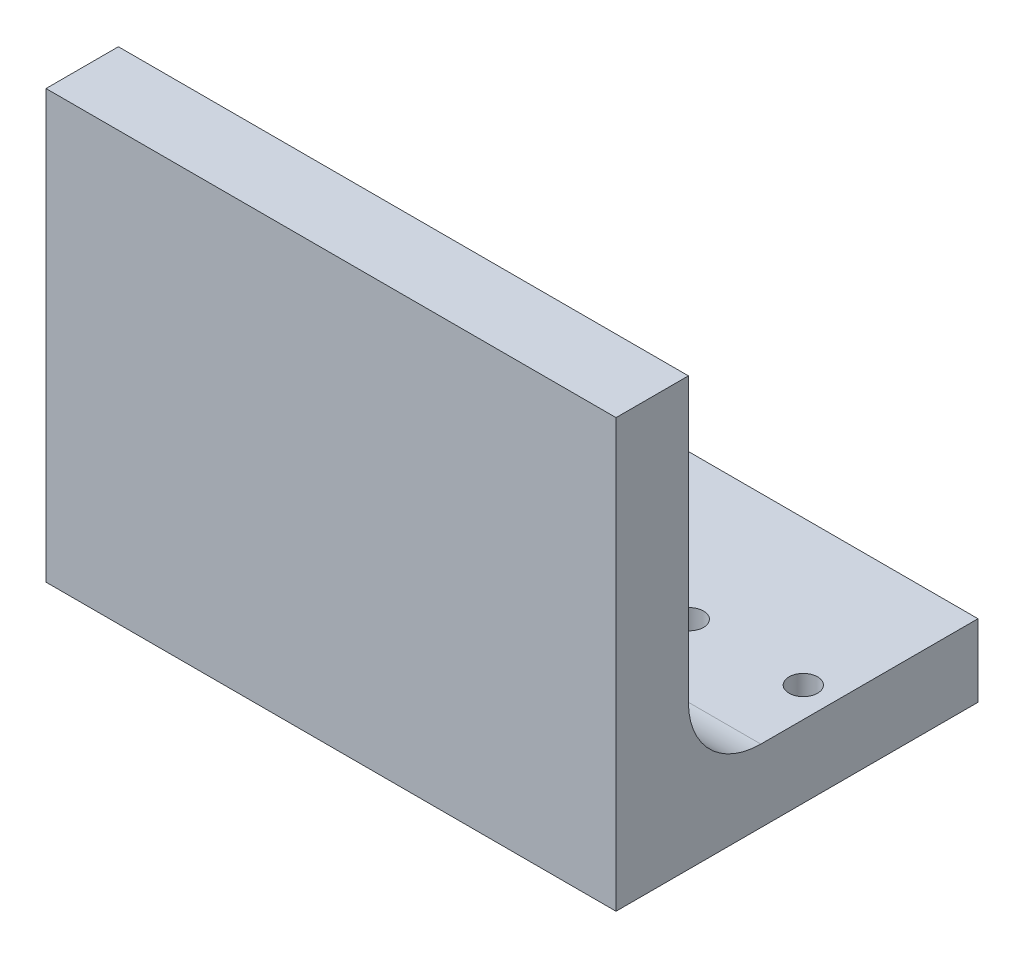
ISO-10303-21;
HEADER;
FILE_DESCRIPTION(('STEP AP214'),'2;1');
FILE_NAME('part.step','',(''),(''),'','','');
FILE_SCHEMA(('AUTOMOTIVE_DESIGN { 1 0 10303 214 1 1 1 1 }'));
ENDSEC;
DATA;
#1=APPLICATION_CONTEXT('core data for automotive mechanical design processes');
#2=APPLICATION_PROTOCOL_DEFINITION('international standard','automotive_design',2000,#1);
#3=PRODUCT_CONTEXT('',#1,'mechanical');
#4=PRODUCT('Part','Part','',(#3));
#5=PRODUCT_RELATED_PRODUCT_CATEGORY('part','',(#4));
#6=PRODUCT_DEFINITION_FORMATION('','',#4);
#7=PRODUCT_DEFINITION_CONTEXT('part definition',#1,'design');
#8=PRODUCT_DEFINITION('design','',#6,#7);
#9=PRODUCT_DEFINITION_SHAPE('','',#8);
#10=(LENGTH_UNIT() NAMED_UNIT(*) SI_UNIT(.MILLI.,.METRE.));
#11=(NAMED_UNIT(*) PLANE_ANGLE_UNIT() SI_UNIT($,.RADIAN.));
#12=(NAMED_UNIT(*) SI_UNIT($,.STERADIAN.) SOLID_ANGLE_UNIT());
#13=UNCERTAINTY_MEASURE_WITH_UNIT(LENGTH_MEASURE(1.E-05),#10,'distance_accuracy_value','');
#14=(GEOMETRIC_REPRESENTATION_CONTEXT(3) GLOBAL_UNCERTAINTY_ASSIGNED_CONTEXT((#13)) GLOBAL_UNIT_ASSIGNED_CONTEXT((#10,
#11,#12)) REPRESENTATION_CONTEXT('',''));
#15=CARTESIAN_POINT('',(0.,0.,0.));
#16=DIRECTION('',(0.,0.,1.));
#17=DIRECTION('',(1.,0.,0.));
#18=AXIS2_PLACEMENT_3D('',#15,#16,#17);
#19=CARTESIAN_POINT('',(0.,0.,0.));
#20=DIRECTION('',(0.,0.,1.));
#21=DIRECTION('',(1.,0.,0.));
#22=AXIS2_PLACEMENT_3D('',#19,#20,#21);
#23=PLANE('',#22);
#24=DIRECTION('',(0.,1.,0.));
#25=VECTOR('',#24,1.);
#26=CARTESIAN_POINT('',(10.,15.,0.));
#27=LINE('',#26,#25);
#28=CARTESIAN_POINT('',(10.,5.08,0.));
#29=VERTEX_POINT('',#28);
#30=CARTESIAN_POINT('',(10.,15.,0.));
#31=VERTEX_POINT('',#30);
#32=EDGE_CURVE('E146',#29,#31,#27,.T.);
#33=ORIENTED_EDGE('',*,*,#32,.F.);
#34=DIRECTION('',(1.,0.,0.));
#35=VECTOR('',#34,1.);
#36=CARTESIAN_POINT('',(-10.,5.08,0.));
#37=LINE('',#36,#35);
#38=CARTESIAN_POINT('',(-10.,5.08,0.));
#39=VERTEX_POINT('',#38);
#40=EDGE_CURVE('E60',#29,#39,#37,.F.);
#41=ORIENTED_EDGE('',*,*,#40,.T.);
#42=DIRECTION('',(0.,-1.,0.));
#43=VECTOR('',#42,1.);
#44=CARTESIAN_POINT('',(-10.,15.,0.));
#45=LINE('',#44,#43);
#46=CARTESIAN_POINT('',(-10.,15.,0.));
#47=VERTEX_POINT('',#46);
#48=EDGE_CURVE('E134',#47,#39,#45,.T.);
#49=ORIENTED_EDGE('',*,*,#48,.F.);
#50=DIRECTION('',(-1.,0.,0.));
#51=VECTOR('',#50,1.);
#52=CARTESIAN_POINT('',(-10.,15.,0.));
#53=LINE('',#52,#51);
#54=EDGE_CURVE('E139',#31,#47,#53,.T.);
#55=ORIENTED_EDGE('',*,*,#54,.F.);
#56=EDGE_LOOP('',(#33,#41,#49,#55));
#57=FACE_BOUND('',#56,.T.);
#58=ADVANCED_FACE('F39',(#57),#23,.F.);
#59=CARTESIAN_POINT('',(-10.,15.,2.54));
#60=DIRECTION('',(1.,0.,0.));
#61=DIRECTION('',(0.,1.,0.));
#62=AXIS2_PLACEMENT_3D('',#59,#60,#61);
#63=PLANE('',#62);
#64=ORIENTED_EDGE('',*,*,#48,.T.);
#65=CARTESIAN_POINT('',(-10.,5.08,-2.54));
#66=DIRECTION('',(1.,0.,0.));
#67=DIRECTION('',(0.,1.,0.));
#68=AXIS2_PLACEMENT_3D('',#65,#66,#67);
#69=CIRCLE('',#68,2.54);
#70=CARTESIAN_POINT('',(-10.,2.54,-2.54));
#71=VERTEX_POINT('',#70);
#72=EDGE_CURVE('E11',#39,#71,#69,.T.);
#73=ORIENTED_EDGE('',*,*,#72,.T.);
#74=DIRECTION('',(0.,0.,1.));
#75=VECTOR('',#74,1.);
#76=CARTESIAN_POINT('',(-10.,2.54,-10.16));
#77=LINE('',#76,#75);
#78=CARTESIAN_POINT('',(-10.,2.54,-10.16));
#79=VERTEX_POINT('',#78);
#80=EDGE_CURVE('E131',#79,#71,#77,.T.);
#81=ORIENTED_EDGE('',*,*,#80,.F.);
#82=DIRECTION('',(0.,1.,0.));
#83=VECTOR('',#82,1.);
#84=CARTESIAN_POINT('',(-10.,0.,-10.16));
#85=LINE('',#84,#83);
#86=CARTESIAN_POINT('',(-10.,0.,-10.16));
#87=VERTEX_POINT('',#86);
#88=EDGE_CURVE('E114',#87,#79,#85,.T.);
#89=ORIENTED_EDGE('',*,*,#88,.F.);
#90=DIRECTION('',(0.,0.,-1.));
#91=VECTOR('',#90,1.);
#92=CARTESIAN_POINT('',(-10.,0.,2.54));
#93=LINE('',#92,#91);
#94=CARTESIAN_POINT('',(-10.,0.,2.54));
#95=VERTEX_POINT('',#94);
#96=EDGE_CURVE('E105',#95,#87,#93,.T.);
#97=ORIENTED_EDGE('',*,*,#96,.F.);
#98=DIRECTION('',(0.,-1.,0.));
#99=VECTOR('',#98,1.);
#100=CARTESIAN_POINT('',(-10.,15.,2.54));
#101=LINE('',#100,#99);
#102=CARTESIAN_POINT('',(-10.,15.,2.54));
#103=VERTEX_POINT('',#102);
#104=EDGE_CURVE('E135',#103,#95,#101,.T.);
#105=ORIENTED_EDGE('',*,*,#104,.F.);
#106=DIRECTION('',(0.,0.,-1.));
#107=VECTOR('',#106,1.);
#108=CARTESIAN_POINT('',(-10.,15.,2.54));
#109=LINE('',#108,#107);
#110=EDGE_CURVE('E144',#103,#47,#109,.T.);
#111=ORIENTED_EDGE('',*,*,#110,.T.);
#112=EDGE_LOOP('',(#64,#73,#81,#89,#97,#105,#111));
#113=FACE_BOUND('',#112,.T.);
#114=ADVANCED_FACE('F164',(#113),#63,.F.);
#115=CARTESIAN_POINT('',(-10.,0.,2.54));
#116=DIRECTION('',(0.,1.,0.));
#117=DIRECTION('',(0.,0.,1.));
#118=AXIS2_PLACEMENT_3D('',#115,#116,#117);
#119=PLANE('',#118);
#120=CARTESIAN_POINT('',(-8.35000000000003,0.,-5.08000000000005));
#121=DIRECTION('',(0.,1.,0.));
#122=DIRECTION('',(0.,0.,1.));
#123=AXIS2_PLACEMENT_3D('',#120,#121,#122);
#124=CIRCLE('',#123,0.500000000000019);
#125=CARTESIAN_POINT('',(-8.35000000000003,0.,-4.58000000000003));
#126=VERTEX_POINT('',#125);
#127=EDGE_CURVE('E199',#126,#126,#124,.T.);
#128=ORIENTED_EDGE('',*,*,#127,.T.);
#129=EDGE_LOOP('',(#128));
#130=FACE_BOUND('',#129,.T.);
#131=CARTESIAN_POINT('',(-4.35000000000003,0.,-5.08000000000008));
#132=DIRECTION('',(0.,1.,0.));
#133=DIRECTION('',(0.,0.,1.));
#134=AXIS2_PLACEMENT_3D('',#131,#132,#133);
#135=CIRCLE('',#134,0.500000000000018);
#136=CARTESIAN_POINT('',(-4.35000000000003,0.,-4.58000000000006));
#137=VERTEX_POINT('',#136);
#138=EDGE_CURVE('E203',#137,#137,#135,.T.);
#139=ORIENTED_EDGE('',*,*,#138,.T.);
#140=EDGE_LOOP('',(#139));
#141=FACE_BOUND('',#140,.T.);
#142=CARTESIAN_POINT('',(4.94999999999997,0.,-5.08000000000001));
#143=DIRECTION('',(0.,1.,0.));
#144=DIRECTION('',(0.,0.,1.));
#145=AXIS2_PLACEMENT_3D('',#142,#143,#144);
#146=CIRCLE('',#145,0.500000000000018);
#147=CARTESIAN_POINT('',(4.94999999999997,0.,-4.57999999999999));
#148=VERTEX_POINT('',#147);
#149=EDGE_CURVE('E207',#148,#148,#146,.T.);
#150=ORIENTED_EDGE('',*,*,#149,.T.);
#151=EDGE_LOOP('',(#150));
#152=FACE_BOUND('',#151,.T.);
#153=CARTESIAN_POINT('',(8.94999999999997,0.,-5.08000000000001));
#154=DIRECTION('',(0.,1.,0.));
#155=DIRECTION('',(0.,0.,1.));
#156=AXIS2_PLACEMENT_3D('',#153,#154,#155);
#157=CIRCLE('',#156,0.500000000000017);
#158=CARTESIAN_POINT('',(8.94999999999997,0.,-4.57999999999999));
#159=VERTEX_POINT('',#158);
#160=EDGE_CURVE('E211',#159,#159,#157,.T.);
#161=ORIENTED_EDGE('',*,*,#160,.T.);
#162=EDGE_LOOP('',(#161));
#163=FACE_BOUND('',#162,.T.);
#164=CARTESIAN_POINT('',(0.,0.,-5.08));
#165=DIRECTION('',(0.,1.,0.));
#166=DIRECTION('',(0.,0.,1.));
#167=AXIS2_PLACEMENT_3D('',#164,#165,#166);
#168=CIRCLE('',#167,2.4765);
#169=CARTESIAN_POINT('',(0.,0.,-2.6035));
#170=VERTEX_POINT('',#169);
#171=EDGE_CURVE('E120',#170,#170,#168,.F.);
#172=ORIENTED_EDGE('',*,*,#171,.F.);
#173=EDGE_LOOP('',(#172));
#174=FACE_BOUND('',#173,.T.);
#175=ORIENTED_EDGE('',*,*,#96,.T.);
#176=DIRECTION('',(-1.,0.,0.));
#177=VECTOR('',#176,1.);
#178=CARTESIAN_POINT('',(10.,0.,-10.16));
#179=LINE('',#178,#177);
#180=CARTESIAN_POINT('',(10.,0.,-10.16));
#181=VERTEX_POINT('',#180);
#182=EDGE_CURVE('E109',#181,#87,#179,.T.);
#183=ORIENTED_EDGE('',*,*,#182,.F.);
#184=DIRECTION('',(0.,0.,-1.));
#185=VECTOR('',#184,1.);
#186=CARTESIAN_POINT('',(10.,0.,2.54));
#187=LINE('',#186,#185);
#188=CARTESIAN_POINT('',(10.,0.,2.54));
#189=VERTEX_POINT('',#188);
#190=EDGE_CURVE('E97',#189,#181,#187,.T.);
#191=ORIENTED_EDGE('',*,*,#190,.F.);
#192=DIRECTION('',(1.,0.,0.));
#193=VECTOR('',#192,1.);
#194=CARTESIAN_POINT('',(-10.,0.,2.54));
#195=LINE('',#194,#193);
#196=EDGE_CURVE('E138',#95,#189,#195,.T.);
#197=ORIENTED_EDGE('',*,*,#196,.F.);
#198=EDGE_LOOP('',(#175,#183,#191,#197));
#199=FACE_BOUND('',#198,.T.);
#200=ADVANCED_FACE('F110',(#130,#141,#152,#163,#174,#199),#119,.F.);
#201=CARTESIAN_POINT('',(10.,15.,2.54));
#202=DIRECTION('',(-1.,0.,0.));
#203=DIRECTION('',(0.,-1.,0.));
#204=AXIS2_PLACEMENT_3D('',#201,#202,#203);
#205=PLANE('',#204);
#206=ORIENTED_EDGE('',*,*,#190,.T.);
#207=DIRECTION('',(0.,-1.,0.));
#208=VECTOR('',#207,1.);
#209=CARTESIAN_POINT('',(10.,0.,-10.16));
#210=LINE('',#209,#208);
#211=CARTESIAN_POINT('',(10.,2.54,-10.16));
#212=VERTEX_POINT('',#211);
#213=EDGE_CURVE('E101',#212,#181,#210,.T.);
#214=ORIENTED_EDGE('',*,*,#213,.F.);
#215=DIRECTION('',(0.,0.,1.));
#216=VECTOR('',#215,1.);
#217=CARTESIAN_POINT('',(10.,2.54,-10.16));
#218=LINE('',#217,#216);
#219=CARTESIAN_POINT('',(10.,2.54,-2.54));
#220=VERTEX_POINT('',#219);
#221=EDGE_CURVE('E129',#212,#220,#218,.T.);
#222=ORIENTED_EDGE('',*,*,#221,.T.);
#223=CARTESIAN_POINT('',(10.,5.08,-2.54));
#224=DIRECTION('',(-1.,0.,0.));
#225=DIRECTION('',(0.,-1.,0.));
#226=AXIS2_PLACEMENT_3D('',#223,#224,#225);
#227=CIRCLE('',#226,2.54);
#228=EDGE_CURVE('E47',#220,#29,#227,.T.);
#229=ORIENTED_EDGE('',*,*,#228,.T.);
#230=ORIENTED_EDGE('',*,*,#32,.T.);
#231=DIRECTION('',(0.,0.,-1.));
#232=VECTOR('',#231,1.);
#233=CARTESIAN_POINT('',(10.,15.,2.54));
#234=LINE('',#233,#232);
#235=CARTESIAN_POINT('',(10.,15.,2.54));
#236=VERTEX_POINT('',#235);
#237=EDGE_CURVE('E106',#236,#31,#234,.T.);
#238=ORIENTED_EDGE('',*,*,#237,.F.);
#239=DIRECTION('',(0.,1.,0.));
#240=VECTOR('',#239,1.);
#241=CARTESIAN_POINT('',(10.,15.,2.54));
#242=LINE('',#241,#240);
#243=EDGE_CURVE('E103',#189,#236,#242,.T.);
#244=ORIENTED_EDGE('',*,*,#243,.F.);
#245=EDGE_LOOP('',(#206,#214,#222,#229,#230,#238,#244));
#246=FACE_BOUND('',#245,.T.);
#247=ADVANCED_FACE('F99',(#246),#205,.F.);
#248=CARTESIAN_POINT('',(-10.,15.,2.54));
#249=DIRECTION('',(0.,-1.,0.));
#250=DIRECTION('',(1.,0.,0.));
#251=AXIS2_PLACEMENT_3D('',#248,#249,#250);
#252=PLANE('',#251);
#253=ORIENTED_EDGE('',*,*,#54,.T.);
#254=ORIENTED_EDGE('',*,*,#110,.F.);
#255=DIRECTION('',(-1.,0.,0.));
#256=VECTOR('',#255,1.);
#257=CARTESIAN_POINT('',(-10.,15.,2.54));
#258=LINE('',#257,#256);
#259=EDGE_CURVE('E142',#236,#103,#258,.T.);
#260=ORIENTED_EDGE('',*,*,#259,.F.);
#261=ORIENTED_EDGE('',*,*,#237,.T.);
#262=EDGE_LOOP('',(#253,#254,#260,#261));
#263=FACE_BOUND('',#262,.T.);
#264=ADVANCED_FACE('F169',(#263),#252,.F.);
#265=CARTESIAN_POINT('',(0.,0.,2.54));
#266=DIRECTION('',(0.,0.,1.));
#267=DIRECTION('',(1.,0.,0.));
#268=AXIS2_PLACEMENT_3D('',#265,#266,#267);
#269=PLANE('',#268);
#270=ORIENTED_EDGE('',*,*,#104,.T.);
#271=ORIENTED_EDGE('',*,*,#196,.T.);
#272=ORIENTED_EDGE('',*,*,#243,.T.);
#273=ORIENTED_EDGE('',*,*,#259,.T.);
#274=EDGE_LOOP('',(#270,#271,#272,#273));
#275=FACE_BOUND('',#274,.T.);
#276=ADVANCED_FACE('F172',(#275),#269,.T.);
#277=CARTESIAN_POINT('',(10.,2.54,-10.16));
#278=DIRECTION('',(0.,-1.,0.));
#279=DIRECTION('',(1.,0.,0.));
#280=AXIS2_PLACEMENT_3D('',#277,#278,#279);
#281=PLANE('',#280);
#282=CARTESIAN_POINT('',(-8.35000000000003,2.54,-5.08000000000005));
#283=DIRECTION('',(0.,1.,0.));
#284=DIRECTION('',(-1.,0.,0.));
#285=AXIS2_PLACEMENT_3D('',#282,#283,#284);
#286=CIRCLE('',#285,0.500000000000019);
#287=CARTESIAN_POINT('',(-8.85000000000005,2.54,-5.08000000000005));
#288=VERTEX_POINT('',#287);
#289=EDGE_CURVE('E245',#288,#288,#286,.T.);
#290=ORIENTED_EDGE('',*,*,#289,.F.);
#291=EDGE_LOOP('',(#290));
#292=FACE_BOUND('',#291,.T.);
#293=CARTESIAN_POINT('',(-4.35000000000003,2.54,-5.08000000000008));
#294=DIRECTION('',(0.,1.,0.));
#295=DIRECTION('',(-1.,0.,0.));
#296=AXIS2_PLACEMENT_3D('',#293,#294,#295);
#297=CIRCLE('',#296,0.500000000000018);
#298=CARTESIAN_POINT('',(-4.85000000000005,2.54,-5.08000000000008));
#299=VERTEX_POINT('',#298);
#300=EDGE_CURVE('E257',#299,#299,#297,.T.);
#301=ORIENTED_EDGE('',*,*,#300,.F.);
#302=EDGE_LOOP('',(#301));
#303=FACE_BOUND('',#302,.T.);
#304=CARTESIAN_POINT('',(4.94999999999997,2.54,-5.08000000000001));
#305=DIRECTION('',(0.,1.,0.));
#306=DIRECTION('',(-1.,0.,0.));
#307=AXIS2_PLACEMENT_3D('',#304,#305,#306);
#308=CIRCLE('',#307,0.500000000000018);
#309=CARTESIAN_POINT('',(4.44999999999995,2.54,-5.08000000000001));
#310=VERTEX_POINT('',#309);
#311=EDGE_CURVE('E254',#310,#310,#308,.T.);
#312=ORIENTED_EDGE('',*,*,#311,.F.);
#313=EDGE_LOOP('',(#312));
#314=FACE_BOUND('',#313,.T.);
#315=CARTESIAN_POINT('',(8.94999999999997,2.54,-5.08000000000001));
#316=DIRECTION('',(0.,1.,0.));
#317=DIRECTION('',(-1.,0.,0.));
#318=AXIS2_PLACEMENT_3D('',#315,#316,#317);
#319=CIRCLE('',#318,0.500000000000017);
#320=CARTESIAN_POINT('',(8.44999999999995,2.54,-5.08000000000001));
#321=VERTEX_POINT('',#320);
#322=EDGE_CURVE('E251',#321,#321,#319,.T.);
#323=ORIENTED_EDGE('',*,*,#322,.F.);
#324=EDGE_LOOP('',(#323));
#325=FACE_BOUND('',#324,.T.);
#326=CARTESIAN_POINT('',(0.,2.54,-5.08));
#327=DIRECTION('',(0.,1.,0.));
#328=DIRECTION('',(-1.,0.,0.));
#329=AXIS2_PLACEMENT_3D('',#326,#327,#328);
#330=CIRCLE('',#329,2.4765);
#331=CARTESIAN_POINT('',(-2.4765,2.54,-5.08));
#332=VERTEX_POINT('',#331);
#333=EDGE_CURVE('E123',#332,#332,#330,.T.);
#334=ORIENTED_EDGE('',*,*,#333,.F.);
#335=EDGE_LOOP('',(#334));
#336=FACE_BOUND('',#335,.T.);
#337=ORIENTED_EDGE('',*,*,#80,.T.);
#338=DIRECTION('',(1.,0.,0.));
#339=VECTOR('',#338,1.);
#340=CARTESIAN_POINT('',(10.,2.54,-2.54));
#341=LINE('',#340,#339);
#342=EDGE_CURVE('E154',#71,#220,#341,.T.);
#343=ORIENTED_EDGE('',*,*,#342,.T.);
#344=ORIENTED_EDGE('',*,*,#221,.F.);
#345=DIRECTION('',(1.,0.,0.));
#346=VECTOR('',#345,1.);
#347=CARTESIAN_POINT('',(10.,2.54,-10.16));
#348=LINE('',#347,#346);
#349=EDGE_CURVE('E118',#79,#212,#348,.T.);
#350=ORIENTED_EDGE('',*,*,#349,.F.);
#351=EDGE_LOOP('',(#337,#343,#344,#350));
#352=FACE_BOUND('',#351,.T.);
#353=ADVANCED_FACE('F159',(#292,#303,#314,#325,#336,#352),#281,.F.);
#354=CARTESIAN_POINT('',(0.,0.,-10.16));
#355=DIRECTION('',(0.,0.,1.));
#356=DIRECTION('',(1.,0.,0.));
#357=AXIS2_PLACEMENT_3D('',#354,#355,#356);
#358=PLANE('',#357);
#359=ORIENTED_EDGE('',*,*,#213,.T.);
#360=ORIENTED_EDGE('',*,*,#182,.T.);
#361=ORIENTED_EDGE('',*,*,#88,.T.);
#362=ORIENTED_EDGE('',*,*,#349,.T.);
#363=EDGE_LOOP('',(#359,#360,#361,#362));
#364=FACE_BOUND('',#363,.T.);
#365=ADVANCED_FACE('F116',(#364),#358,.F.);
#366=CARTESIAN_POINT('',(0.,-0.00100000000000143,-5.08));
#367=DIRECTION('',(0.,1.,0.));
#368=DIRECTION('',(-1.,0.,0.));
#369=AXIS2_PLACEMENT_3D('',#366,#367,#368);
#370=CYLINDRICAL_SURFACE('',#369,2.4765);
#371=ORIENTED_EDGE('',*,*,#333,.T.);
#372=EDGE_LOOP('',(#371));
#373=FACE_BOUND('',#372,.T.);
#374=ORIENTED_EDGE('',*,*,#171,.T.);
#375=EDGE_LOOP('',(#374));
#376=FACE_BOUND('',#375,.T.);
#377=ADVANCED_FACE('F214',(#373,#376),#370,.F.);
#378=CARTESIAN_POINT('',(10.,5.08,-2.54));
#379=DIRECTION('',(-1.,0.,0.));
#380=DIRECTION('',(0.,-1.,0.));
#381=AXIS2_PLACEMENT_3D('',#378,#379,#380);
#382=CYLINDRICAL_SURFACE('',#381,2.54);
#383=ORIENTED_EDGE('',*,*,#72,.F.);
#384=ORIENTED_EDGE('',*,*,#40,.F.);
#385=ORIENTED_EDGE('',*,*,#228,.F.);
#386=ORIENTED_EDGE('',*,*,#342,.F.);
#387=EDGE_LOOP('',(#383,#384,#385,#386));
#388=FACE_BOUND('',#387,.T.);
#389=ADVANCED_FACE('F41',(#388),#382,.F.);
#390=CARTESIAN_POINT('',(8.94999999999997,-7.46,-5.08000000000001));
#391=DIRECTION('',(0.,1.,0.));
#392=DIRECTION('',(-1.,0.,0.));
#393=AXIS2_PLACEMENT_3D('',#390,#391,#392);
#394=CYLINDRICAL_SURFACE('',#393,0.500000000000017);
#395=ORIENTED_EDGE('',*,*,#322,.T.);
#396=EDGE_LOOP('',(#395));
#397=FACE_BOUND('',#396,.T.);
#398=ORIENTED_EDGE('',*,*,#160,.F.);
#399=EDGE_LOOP('',(#398));
#400=FACE_BOUND('',#399,.T.);
#401=ADVANCED_FACE('F222',(#397,#400),#394,.F.);
#402=CARTESIAN_POINT('',(4.94999999999997,-7.46,-5.08000000000001));
#403=DIRECTION('',(0.,1.,0.));
#404=DIRECTION('',(-1.,0.,0.));
#405=AXIS2_PLACEMENT_3D('',#402,#403,#404);
#406=CYLINDRICAL_SURFACE('',#405,0.500000000000018);
#407=ORIENTED_EDGE('',*,*,#311,.T.);
#408=EDGE_LOOP('',(#407));
#409=FACE_BOUND('',#408,.T.);
#410=ORIENTED_EDGE('',*,*,#149,.F.);
#411=EDGE_LOOP('',(#410));
#412=FACE_BOUND('',#411,.T.);
#413=ADVANCED_FACE('F228',(#409,#412),#406,.F.);
#414=CARTESIAN_POINT('',(-4.35000000000003,-7.46,-5.08000000000008));
#415=DIRECTION('',(0.,1.,0.));
#416=DIRECTION('',(-1.,0.,0.));
#417=AXIS2_PLACEMENT_3D('',#414,#415,#416);
#418=CYLINDRICAL_SURFACE('',#417,0.500000000000018);
#419=ORIENTED_EDGE('',*,*,#300,.T.);
#420=EDGE_LOOP('',(#419));
#421=FACE_BOUND('',#420,.T.);
#422=ORIENTED_EDGE('',*,*,#138,.F.);
#423=EDGE_LOOP('',(#422));
#424=FACE_BOUND('',#423,.T.);
#425=ADVANCED_FACE('F232',(#421,#424),#418,.F.);
#426=CARTESIAN_POINT('',(-8.35000000000003,-7.46,-5.08000000000005));
#427=DIRECTION('',(0.,1.,0.));
#428=DIRECTION('',(-1.,0.,0.));
#429=AXIS2_PLACEMENT_3D('',#426,#427,#428);
#430=CYLINDRICAL_SURFACE('',#429,0.500000000000019);
#431=ORIENTED_EDGE('',*,*,#289,.T.);
#432=EDGE_LOOP('',(#431));
#433=FACE_BOUND('',#432,.T.);
#434=ORIENTED_EDGE('',*,*,#127,.F.);
#435=EDGE_LOOP('',(#434));
#436=FACE_BOUND('',#435,.T.);
#437=ADVANCED_FACE('F236',(#433,#436),#430,.F.);
#438=CLOSED_SHELL('',(#58,#114,#200,#247,#264,#276,#353,#365,#377,#389,#401,#413,#425,#437));
#439=MANIFOLD_SOLID_BREP('B2',#438);
#440=ADVANCED_BREP_SHAPE_REPRESENTATION('',(#18,#439),#14);
#441=SHAPE_DEFINITION_REPRESENTATION(#9,#440);
ENDSEC;
END-ISO-10303-21;
